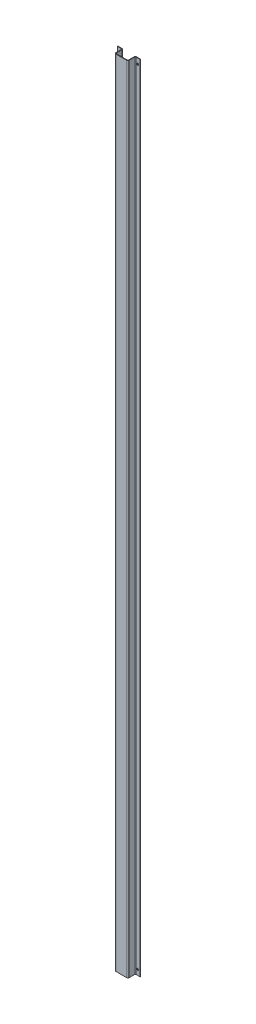
ISO-10303-21;
HEADER;
FILE_DESCRIPTION(('STEP AP214'),'2;1');
FILE_NAME('part.step','',(''),(''),'','','');
FILE_SCHEMA(('AUTOMOTIVE_DESIGN { 1 0 10303 214 1 1 1 1 }'));
ENDSEC;
DATA;
#1=APPLICATION_CONTEXT('core data for automotive mechanical design processes');
#2=APPLICATION_PROTOCOL_DEFINITION('international standard','automotive_design',2000,#1);
#3=PRODUCT_CONTEXT('',#1,'mechanical');
#4=PRODUCT('Part','Part','',(#3));
#5=PRODUCT_RELATED_PRODUCT_CATEGORY('part','',(#4));
#6=PRODUCT_DEFINITION_FORMATION('','',#4);
#7=PRODUCT_DEFINITION_CONTEXT('part definition',#1,'design');
#8=PRODUCT_DEFINITION('design','',#6,#7);
#9=PRODUCT_DEFINITION_SHAPE('','',#8);
#10=(LENGTH_UNIT() NAMED_UNIT(*) SI_UNIT(.MILLI.,.METRE.));
#11=(NAMED_UNIT(*) PLANE_ANGLE_UNIT() SI_UNIT($,.RADIAN.));
#12=(NAMED_UNIT(*) SI_UNIT($,.STERADIAN.) SOLID_ANGLE_UNIT());
#13=UNCERTAINTY_MEASURE_WITH_UNIT(LENGTH_MEASURE(1.E-05),#10,'distance_accuracy_value','');
#14=(GEOMETRIC_REPRESENTATION_CONTEXT(3) GLOBAL_UNCERTAINTY_ASSIGNED_CONTEXT((#13)) GLOBAL_UNIT_ASSIGNED_CONTEXT((#10,
#11,#12)) REPRESENTATION_CONTEXT('',''));
#15=CARTESIAN_POINT('',(0.,0.,0.));
#16=DIRECTION('',(0.,0.,1.));
#17=DIRECTION('',(1.,0.,0.));
#18=AXIS2_PLACEMENT_3D('',#15,#16,#17);
#19=CARTESIAN_POINT('',(25.0000000000001,1500.,-30.));
#20=DIRECTION('',(0.,1.,1.11022302462516E-13));
#21=DIRECTION('',(0.,-1.11022302462516E-13,1.));
#22=AXIS2_PLACEMENT_3D('',#19,#20,#21);
#23=PLANE('',#22);
#24=DIRECTION('',(0.,1.11022302462516E-13,-1.));
#25=VECTOR('',#24,1.);
#26=CARTESIAN_POINT('',(25.0000000000001,1500.,-30.));
#27=LINE('',#26,#25);
#28=CARTESIAN_POINT('',(25.,1500.,-4.50000000000001));
#29=VERTEX_POINT('',#28);
#30=CARTESIAN_POINT('',(25.0000000000001,1500.,-25.5));
#31=VERTEX_POINT('',#30);
#32=EDGE_CURVE('E422',#29,#31,#27,.T.);
#33=ORIENTED_EDGE('',*,*,#32,.T.);
#34=DIRECTION('',(-1.,0.,0.));
#35=VECTOR('',#34,1.);
#36=CARTESIAN_POINT('',(25.,1500.,-25.5));
#37=LINE('',#36,#35);
#38=CARTESIAN_POINT('',(23.,1500.,-25.5));
#39=VERTEX_POINT('',#38);
#40=EDGE_CURVE('E309',#31,#39,#37,.T.);
#41=ORIENTED_EDGE('',*,*,#40,.T.);
#42=DIRECTION('',(0.,-1.11022302462516E-13,1.));
#43=VECTOR('',#42,1.);
#44=CARTESIAN_POINT('',(23.,1500.,1.66620189867572E-10));
#45=LINE('',#44,#43);
#46=CARTESIAN_POINT('',(23.,1500.,-4.50000000000002));
#47=VERTEX_POINT('',#46);
#48=EDGE_CURVE('E426',#47,#39,#45,.F.);
#49=ORIENTED_EDGE('',*,*,#48,.F.);
#50=DIRECTION('',(1.,0.,0.));
#51=VECTOR('',#50,1.);
#52=CARTESIAN_POINT('',(25.,1500.,-4.49999999999999));
#53=LINE('',#52,#51);
#54=EDGE_CURVE('E416',#47,#29,#53,.T.);
#55=ORIENTED_EDGE('',*,*,#54,.T.);
#56=EDGE_LOOP('',(#33,#41,#49,#55));
#57=FACE_BOUND('',#56,.T.);
#58=ADVANCED_FACE('F120',(#57),#23,.T.);
#59=CARTESIAN_POINT('',(25.,0.,0.));
#60=DIRECTION('',(1.,0.,0.));
#61=DIRECTION('',(0.,0.,-1.));
#62=AXIS2_PLACEMENT_3D('',#59,#60,#61);
#63=PLANE('',#62);
#64=DIRECTION('',(0.,-1.11022302462516E-13,1.));
#65=VECTOR('',#64,1.);
#66=CARTESIAN_POINT('',(25.,-1500.,-1.99999999999999));
#67=LINE('',#66,#65);
#68=CARTESIAN_POINT('',(25.0000000000001,-1500.,-25.5));
#69=VERTEX_POINT('',#68);
#70=CARTESIAN_POINT('',(25.,-1500.,-4.50000000000003));
#71=VERTEX_POINT('',#70);
#72=EDGE_CURVE('E419',#69,#71,#67,.T.);
#73=ORIENTED_EDGE('',*,*,#72,.F.);
#74=DIRECTION('',(0.,1.,0.));
#75=VECTOR('',#74,1.);
#76=CARTESIAN_POINT('',(25.,1500.,-25.5));
#77=LINE('',#76,#75);
#78=EDGE_CURVE('E144',#31,#69,#77,.F.);
#79=ORIENTED_EDGE('',*,*,#78,.F.);
#80=ORIENTED_EDGE('',*,*,#32,.F.);
#81=DIRECTION('',(0.,-1.,0.));
#82=VECTOR('',#81,1.);
#83=CARTESIAN_POINT('',(25.,0.,-4.50000000000001));
#84=LINE('',#83,#82);
#85=EDGE_CURVE('E429',#29,#71,#84,.T.);
#86=ORIENTED_EDGE('',*,*,#85,.T.);
#87=EDGE_LOOP('',(#73,#79,#80,#86));
#88=FACE_BOUND('',#87,.T.);
#89=ADVANCED_FACE('F480',(#88),#63,.T.);
#90=CARTESIAN_POINT('',(23.,0.,0.));
#91=DIRECTION('',(1.,0.,0.));
#92=DIRECTION('',(0.,0.,-1.));
#93=AXIS2_PLACEMENT_3D('',#90,#91,#92);
#94=PLANE('',#93);
#95=DIRECTION('',(0.,1.,0.));
#96=VECTOR('',#95,1.);
#97=CARTESIAN_POINT('',(23.,1500.,-25.5));
#98=LINE('',#97,#96);
#99=CARTESIAN_POINT('',(23.0000000000001,-1500.,-25.5));
#100=VERTEX_POINT('',#99);
#101=EDGE_CURVE('E303',#39,#100,#98,.F.);
#102=ORIENTED_EDGE('',*,*,#101,.T.);
#103=DIRECTION('',(0.,1.11022302462516E-13,-1.));
#104=VECTOR('',#103,1.);
#105=CARTESIAN_POINT('',(23.,-1500.,-1.66446717519975E-10));
#106=LINE('',#105,#104);
#107=CARTESIAN_POINT('',(23.,-1500.,-4.50000000000002));
#108=VERTEX_POINT('',#107);
#109=EDGE_CURVE('E424',#100,#108,#106,.F.);
#110=ORIENTED_EDGE('',*,*,#109,.T.);
#111=DIRECTION('',(0.,1.,0.));
#112=VECTOR('',#111,1.);
#113=CARTESIAN_POINT('',(23.,1500.,-4.49999999999999));
#114=LINE('',#113,#112);
#115=EDGE_CURVE('E435',#47,#108,#114,.F.);
#116=ORIENTED_EDGE('',*,*,#115,.F.);
#117=ORIENTED_EDGE('',*,*,#48,.T.);
#118=EDGE_LOOP('',(#102,#110,#116,#117));
#119=FACE_BOUND('',#118,.T.);
#120=ADVANCED_FACE('F490',(#119),#94,.F.);
#121=CARTESIAN_POINT('',(-25.0000000000001,-1500.,-30.));
#122=DIRECTION('',(0.,-1.,-1.11022302462516E-13));
#123=DIRECTION('',(0.,1.11022302462516E-13,-1.));
#124=AXIS2_PLACEMENT_3D('',#121,#122,#123);
#125=PLANE('',#124);
#126=DIRECTION('',(0.,1.11022302462516E-13,-1.));
#127=VECTOR('',#126,1.);
#128=CARTESIAN_POINT('',(-25.0000000000001,-1500.,-30.));
#129=LINE('',#128,#127);
#130=CARTESIAN_POINT('',(-25.,-1500.,-4.49999999999996));
#131=VERTEX_POINT('',#130);
#132=CARTESIAN_POINT('',(-25.0000000000001,-1500.,-25.5));
#133=VERTEX_POINT('',#132);
#134=EDGE_CURVE('E377',#131,#133,#129,.T.);
#135=ORIENTED_EDGE('',*,*,#134,.T.);
#136=DIRECTION('',(1.,0.,0.));
#137=VECTOR('',#136,1.);
#138=CARTESIAN_POINT('',(-25.0000000000001,-1500.,-25.5));
#139=LINE('',#138,#137);
#140=CARTESIAN_POINT('',(-23.0000000000001,-1500.,-25.5));
#141=VERTEX_POINT('',#140);
#142=EDGE_CURVE('E358',#133,#141,#139,.T.);
#143=ORIENTED_EDGE('',*,*,#142,.T.);
#144=DIRECTION('',(0.,-1.11022302462516E-13,1.));
#145=VECTOR('',#144,1.);
#146=CARTESIAN_POINT('',(-23.,-1500.,-1.66446717519975E-10));
#147=LINE('',#146,#145);
#148=CARTESIAN_POINT('',(-23.,-1500.,-4.49999999999997));
#149=VERTEX_POINT('',#148);
#150=EDGE_CURVE('E382',#149,#141,#147,.F.);
#151=ORIENTED_EDGE('',*,*,#150,.F.);
#152=DIRECTION('',(-1.,0.,0.));
#153=VECTOR('',#152,1.);
#154=CARTESIAN_POINT('',(-25.,-1500.,-4.49999999999999));
#155=LINE('',#154,#153);
#156=EDGE_CURVE('E372',#149,#131,#155,.T.);
#157=ORIENTED_EDGE('',*,*,#156,.T.);
#158=EDGE_LOOP('',(#135,#143,#151,#157));
#159=FACE_BOUND('',#158,.T.);
#160=ADVANCED_FACE('F599',(#159),#125,.T.);
#161=CARTESIAN_POINT('',(-25.,0.,0.));
#162=DIRECTION('',(-1.,0.,0.));
#163=DIRECTION('',(0.,0.,1.));
#164=AXIS2_PLACEMENT_3D('',#161,#162,#163);
#165=PLANE('',#164);
#166=DIRECTION('',(0.,-1.11022302462516E-13,1.));
#167=VECTOR('',#166,1.);
#168=CARTESIAN_POINT('',(-25.,1500.,-1.99999999999999));
#169=LINE('',#168,#167);
#170=CARTESIAN_POINT('',(-25.0000000000001,1500.,-25.5));
#171=VERTEX_POINT('',#170);
#172=CARTESIAN_POINT('',(-25.,1500.,-4.49999999999994));
#173=VERTEX_POINT('',#172);
#174=EDGE_CURVE('E374',#171,#173,#169,.T.);
#175=ORIENTED_EDGE('',*,*,#174,.F.);
#176=DIRECTION('',(0.,-1.,0.));
#177=VECTOR('',#176,1.);
#178=CARTESIAN_POINT('',(-25.0000000000001,-1500.,-25.5));
#179=LINE('',#178,#177);
#180=EDGE_CURVE('E364',#133,#171,#179,.F.);
#181=ORIENTED_EDGE('',*,*,#180,.F.);
#182=ORIENTED_EDGE('',*,*,#134,.F.);
#183=DIRECTION('',(0.,1.,0.));
#184=VECTOR('',#183,1.);
#185=CARTESIAN_POINT('',(-25.,0.,-4.49999999999996));
#186=LINE('',#185,#184);
#187=EDGE_CURVE('E385',#131,#173,#186,.T.);
#188=ORIENTED_EDGE('',*,*,#187,.T.);
#189=EDGE_LOOP('',(#175,#181,#182,#188));
#190=FACE_BOUND('',#189,.T.);
#191=ADVANCED_FACE('F603',(#190),#165,.T.);
#192=CARTESIAN_POINT('',(-23.,0.,0.));
#193=DIRECTION('',(-1.,0.,0.));
#194=DIRECTION('',(0.,0.,1.));
#195=AXIS2_PLACEMENT_3D('',#192,#193,#194);
#196=PLANE('',#195);
#197=DIRECTION('',(0.,-1.,0.));
#198=VECTOR('',#197,1.);
#199=CARTESIAN_POINT('',(-23.0000000000001,-1500.,-25.5));
#200=LINE('',#199,#198);
#201=CARTESIAN_POINT('',(-23.0000000000001,1500.,-25.5));
#202=VERTEX_POINT('',#201);
#203=EDGE_CURVE('E352',#141,#202,#200,.F.);
#204=ORIENTED_EDGE('',*,*,#203,.T.);
#205=DIRECTION('',(0.,1.11022302462516E-13,-1.));
#206=VECTOR('',#205,1.);
#207=CARTESIAN_POINT('',(-23.,1500.,1.66620189867572E-10));
#208=LINE('',#207,#206);
#209=CARTESIAN_POINT('',(-23.,1500.,-4.49999999999997));
#210=VERTEX_POINT('',#209);
#211=EDGE_CURVE('E380',#202,#210,#208,.F.);
#212=ORIENTED_EDGE('',*,*,#211,.T.);
#213=DIRECTION('',(0.,-1.,0.));
#214=VECTOR('',#213,1.);
#215=CARTESIAN_POINT('',(-23.,-1500.,-4.49999999999999));
#216=LINE('',#215,#214);
#217=EDGE_CURVE('E391',#149,#210,#216,.F.);
#218=ORIENTED_EDGE('',*,*,#217,.F.);
#219=ORIENTED_EDGE('',*,*,#150,.T.);
#220=EDGE_LOOP('',(#204,#212,#218,#219));
#221=FACE_BOUND('',#220,.T.);
#222=ADVANCED_FACE('F577',(#221),#196,.F.);
#223=CARTESIAN_POINT('',(0.,0.,-2.));
#224=DIRECTION('',(0.,0.,-1.));
#225=DIRECTION('',(-1.,0.,0.));
#226=AXIS2_PLACEMENT_3D('',#223,#224,#225);
#227=PLANE('',#226);
#228=DIRECTION('',(1.,0.,0.));
#229=VECTOR('',#228,1.);
#230=CARTESIAN_POINT('',(-25.,-1500.,-2.));
#231=LINE('',#230,#229);
#232=CARTESIAN_POINT('',(-20.5,-1500.,-1.99999999999998));
#233=VERTEX_POINT('',#232);
#234=CARTESIAN_POINT('',(20.5,-1500.,-2.));
#235=VERTEX_POINT('',#234);
#236=EDGE_CURVE('E13',#233,#235,#231,.T.);
#237=ORIENTED_EDGE('',*,*,#236,.F.);
#238=DIRECTION('',(0.,1.,0.));
#239=VECTOR('',#238,1.);
#240=CARTESIAN_POINT('',(-20.5,1500.,-1.99999999999998));
#241=LINE('',#240,#239);
#242=CARTESIAN_POINT('',(-20.5,1500.,-1.99999999999998));
#243=VERTEX_POINT('',#242);
#244=EDGE_CURVE('E408',#243,#233,#241,.F.);
#245=ORIENTED_EDGE('',*,*,#244,.F.);
#246=DIRECTION('',(-1.,0.,0.));
#247=VECTOR('',#246,1.);
#248=CARTESIAN_POINT('',(-25.,1500.,-2.));
#249=LINE('',#248,#247);
#250=CARTESIAN_POINT('',(20.5,1500.,-2.));
#251=VERTEX_POINT('',#250);
#252=EDGE_CURVE('E129',#251,#243,#249,.T.);
#253=ORIENTED_EDGE('',*,*,#252,.F.);
#254=DIRECTION('',(0.,-1.,0.));
#255=VECTOR('',#254,1.);
#256=CARTESIAN_POINT('',(20.5,-1500.,-2.00000000000002));
#257=LINE('',#256,#255);
#258=EDGE_CURVE('E452',#235,#251,#257,.F.);
#259=ORIENTED_EDGE('',*,*,#258,.F.);
#260=EDGE_LOOP('',(#237,#245,#253,#259));
#261=FACE_BOUND('',#260,.T.);
#262=ADVANCED_FACE('F574',(#261),#227,.T.);
#263=CARTESIAN_POINT('',(0.,0.,0.));
#264=DIRECTION('',(0.,0.,-1.));
#265=DIRECTION('',(-1.,0.,0.));
#266=AXIS2_PLACEMENT_3D('',#263,#264,#265);
#267=PLANE('',#266);
#268=DIRECTION('',(0.,1.,0.));
#269=VECTOR('',#268,1.);
#270=CARTESIAN_POINT('',(-20.5,1500.,0.));
#271=LINE('',#270,#269);
#272=CARTESIAN_POINT('',(-20.5,1500.,0.));
#273=VERTEX_POINT('',#272);
#274=CARTESIAN_POINT('',(-20.5,-1500.,0.));
#275=VERTEX_POINT('',#274);
#276=EDGE_CURVE('E396',#273,#275,#271,.F.);
#277=ORIENTED_EDGE('',*,*,#276,.T.);
#278=DIRECTION('',(1.,0.,0.));
#279=VECTOR('',#278,1.);
#280=CARTESIAN_POINT('',(-25.,-1500.,0.));
#281=LINE('',#280,#279);
#282=CARTESIAN_POINT('',(20.5,-1500.,0.));
#283=VERTEX_POINT('',#282);
#284=EDGE_CURVE('E124',#275,#283,#281,.T.);
#285=ORIENTED_EDGE('',*,*,#284,.T.);
#286=DIRECTION('',(0.,-1.,0.));
#287=VECTOR('',#286,1.);
#288=CARTESIAN_POINT('',(20.5,-1500.,0.));
#289=LINE('',#288,#287);
#290=CARTESIAN_POINT('',(20.5,1500.,0.));
#291=VERTEX_POINT('',#290);
#292=EDGE_CURVE('E440',#283,#291,#289,.F.);
#293=ORIENTED_EDGE('',*,*,#292,.T.);
#294=DIRECTION('',(-1.,0.,0.));
#295=VECTOR('',#294,1.);
#296=CARTESIAN_POINT('',(-25.,1500.,0.));
#297=LINE('',#296,#295);
#298=EDGE_CURVE('E460',#291,#273,#297,.T.);
#299=ORIENTED_EDGE('',*,*,#298,.T.);
#300=EDGE_LOOP('',(#277,#285,#293,#299));
#301=FACE_BOUND('',#300,.T.);
#302=ADVANCED_FACE('F468',(#301),#267,.F.);
#303=CARTESIAN_POINT('',(-25.,1500.,-2.));
#304=DIRECTION('',(0.,1.,0.));
#305=DIRECTION('',(0.,0.,1.));
#306=AXIS2_PLACEMENT_3D('',#303,#304,#305);
#307=PLANE('',#306);
#308=ORIENTED_EDGE('',*,*,#252,.T.);
#309=DIRECTION('',(0.,0.,1.));
#310=VECTOR('',#309,1.);
#311=CARTESIAN_POINT('',(-20.5,1500.,-1.99999999999998));
#312=LINE('',#311,#310);
#313=EDGE_CURVE('E402',#243,#273,#312,.T.);
#314=ORIENTED_EDGE('',*,*,#313,.T.);
#315=ORIENTED_EDGE('',*,*,#298,.F.);
#316=DIRECTION('',(0.,0.,1.));
#317=VECTOR('',#316,1.);
#318=CARTESIAN_POINT('',(20.5,1500.,-2.00000000000002));
#319=LINE('',#318,#317);
#320=EDGE_CURVE('E457',#251,#291,#319,.T.);
#321=ORIENTED_EDGE('',*,*,#320,.F.);
#322=EDGE_LOOP('',(#308,#314,#315,#321));
#323=FACE_BOUND('',#322,.T.);
#324=ADVANCED_FACE('F122',(#323),#307,.T.);
#325=CARTESIAN_POINT('',(-25.,-1500.,-2.));
#326=DIRECTION('',(0.,-1.,0.));
#327=DIRECTION('',(0.,0.,-1.));
#328=AXIS2_PLACEMENT_3D('',#325,#326,#327);
#329=PLANE('',#328);
#330=DIRECTION('',(0.,0.,1.));
#331=VECTOR('',#330,1.);
#332=CARTESIAN_POINT('',(-20.5,-1500.,-1.99999999999998));
#333=LINE('',#332,#331);
#334=EDGE_CURVE('E413',#233,#275,#333,.T.);
#335=ORIENTED_EDGE('',*,*,#334,.F.);
#336=ORIENTED_EDGE('',*,*,#236,.T.);
#337=DIRECTION('',(0.,0.,1.));
#338=VECTOR('',#337,1.);
#339=CARTESIAN_POINT('',(20.5,-1500.,-2.00000000000002));
#340=LINE('',#339,#338);
#341=EDGE_CURVE('E446',#235,#283,#340,.T.);
#342=ORIENTED_EDGE('',*,*,#341,.T.);
#343=ORIENTED_EDGE('',*,*,#284,.F.);
#344=EDGE_LOOP('',(#335,#336,#342,#343));
#345=FACE_BOUND('',#344,.T.);
#346=ADVANCED_FACE('F571',(#345),#329,.T.);
#347=CARTESIAN_POINT('',(20.5,1500.,-4.50000000000002));
#348=DIRECTION('',(0.,1.,0.));
#349=DIRECTION('',(0.,0.,1.));
#350=AXIS2_PLACEMENT_3D('',#347,#348,#349);
#351=PLANE('',#350);
#352=ORIENTED_EDGE('',*,*,#54,.F.);
#353=CARTESIAN_POINT('',(20.5,1500.,-4.50000000000002));
#354=DIRECTION('',(0.,-1.,0.));
#355=DIRECTION('',(0.,0.,-1.));
#356=AXIS2_PLACEMENT_3D('',#353,#354,#355);
#357=CIRCLE('',#356,2.5);
#358=EDGE_CURVE('E449',#251,#47,#357,.F.);
#359=ORIENTED_EDGE('',*,*,#358,.F.);
#360=ORIENTED_EDGE('',*,*,#320,.T.);
#361=CARTESIAN_POINT('',(20.5,1500.,-4.50000000000002));
#362=DIRECTION('',(0.,-1.,0.));
#363=DIRECTION('',(0.,0.,-1.));
#364=AXIS2_PLACEMENT_3D('',#361,#362,#363);
#365=CIRCLE('',#364,4.5);
#366=EDGE_CURVE('E442',#291,#29,#365,.F.);
#367=ORIENTED_EDGE('',*,*,#366,.T.);
#368=EDGE_LOOP('',(#352,#359,#360,#367));
#369=FACE_BOUND('',#368,.T.);
#370=ADVANCED_FACE('F482',(#369),#351,.T.);
#371=CARTESIAN_POINT('',(20.5,-1500.,-4.50000000000002));
#372=DIRECTION('',(0.,1.,0.));
#373=DIRECTION('',(0.,0.,1.));
#374=AXIS2_PLACEMENT_3D('',#371,#372,#373);
#375=PLANE('',#374);
#376=CARTESIAN_POINT('',(20.5,-1500.,-4.50000000000002));
#377=DIRECTION('',(0.,-1.,0.));
#378=DIRECTION('',(0.,0.,-1.));
#379=AXIS2_PLACEMENT_3D('',#376,#377,#378);
#380=CIRCLE('',#379,2.5);
#381=EDGE_CURVE('E421',#108,#235,#380,.T.);
#382=ORIENTED_EDGE('',*,*,#381,.F.);
#383=DIRECTION('',(1.,0.,0.));
#384=VECTOR('',#383,1.);
#385=CARTESIAN_POINT('',(23.,-1500.,-4.50000000000004));
#386=LINE('',#385,#384);
#387=EDGE_CURVE('E432',#108,#71,#386,.T.);
#388=ORIENTED_EDGE('',*,*,#387,.T.);
#389=CARTESIAN_POINT('',(20.5,-1500.,-4.50000000000002));
#390=DIRECTION('',(0.,-1.,0.));
#391=DIRECTION('',(0.,0.,-1.));
#392=AXIS2_PLACEMENT_3D('',#389,#390,#391);
#393=CIRCLE('',#392,4.5);
#394=EDGE_CURVE('E443',#71,#283,#393,.T.);
#395=ORIENTED_EDGE('',*,*,#394,.T.);
#396=ORIENTED_EDGE('',*,*,#341,.F.);
#397=EDGE_LOOP('',(#382,#388,#395,#396));
#398=FACE_BOUND('',#397,.T.);
#399=ADVANCED_FACE('F478',(#398),#375,.F.);
#400=CARTESIAN_POINT('',(20.5,-1500.,-4.50000000000002));
#401=DIRECTION('',(0.,-1.,0.));
#402=DIRECTION('',(1.,0.,0.));
#403=AXIS2_PLACEMENT_3D('',#400,#401,#402);
#404=CYLINDRICAL_SURFACE('',#403,4.5);
#405=ORIENTED_EDGE('',*,*,#292,.F.);
#406=ORIENTED_EDGE('',*,*,#394,.F.);
#407=ORIENTED_EDGE('',*,*,#85,.F.);
#408=ORIENTED_EDGE('',*,*,#366,.F.);
#409=EDGE_LOOP('',(#405,#406,#407,#408));
#410=FACE_BOUND('',#409,.T.);
#411=ADVANCED_FACE('F474',(#410),#404,.T.);
#412=CARTESIAN_POINT('',(20.5,-1500.,-4.50000000000002));
#413=DIRECTION('',(0.,-1.,0.));
#414=DIRECTION('',(1.,0.,0.));
#415=AXIS2_PLACEMENT_3D('',#412,#413,#414);
#416=CYLINDRICAL_SURFACE('',#415,2.5);
#417=ORIENTED_EDGE('',*,*,#258,.T.);
#418=ORIENTED_EDGE('',*,*,#358,.T.);
#419=ORIENTED_EDGE('',*,*,#115,.T.);
#420=ORIENTED_EDGE('',*,*,#381,.T.);
#421=EDGE_LOOP('',(#417,#418,#419,#420));
#422=FACE_BOUND('',#421,.T.);
#423=ADVANCED_FACE('F565',(#422),#416,.F.);
#424=CARTESIAN_POINT('',(25.,-1500.,-1.99999999999999));
#425=DIRECTION('',(0.,-1.,-1.11022302462516E-13));
#426=DIRECTION('',(0.,1.11022302462516E-13,-1.));
#427=AXIS2_PLACEMENT_3D('',#424,#425,#426);
#428=PLANE('',#427);
#429=DIRECTION('',(-1.,0.,0.));
#430=VECTOR('',#429,1.);
#431=CARTESIAN_POINT('',(25.,-1500.,-25.5));
#432=LINE('',#431,#430);
#433=EDGE_CURVE('E137',#69,#100,#432,.T.);
#434=ORIENTED_EDGE('',*,*,#433,.F.);
#435=ORIENTED_EDGE('',*,*,#72,.T.);
#436=ORIENTED_EDGE('',*,*,#387,.F.);
#437=ORIENTED_EDGE('',*,*,#109,.F.);
#438=EDGE_LOOP('',(#434,#435,#436,#437));
#439=FACE_BOUND('',#438,.T.);
#440=ADVANCED_FACE('F561',(#439),#428,.T.);
#441=CARTESIAN_POINT('',(-20.5,-1500.,-4.49999999999998));
#442=DIRECTION('',(0.,-1.,0.));
#443=DIRECTION('',(0.,0.,-1.));
#444=AXIS2_PLACEMENT_3D('',#441,#442,#443);
#445=PLANE('',#444);
#446=ORIENTED_EDGE('',*,*,#156,.F.);
#447=CARTESIAN_POINT('',(-20.5,-1500.,-4.49999999999998));
#448=DIRECTION('',(0.,1.,0.));
#449=DIRECTION('',(0.,0.,1.));
#450=AXIS2_PLACEMENT_3D('',#447,#448,#449);
#451=CIRCLE('',#450,2.5);
#452=EDGE_CURVE('E405',#233,#149,#451,.F.);
#453=ORIENTED_EDGE('',*,*,#452,.F.);
#454=ORIENTED_EDGE('',*,*,#334,.T.);
#455=CARTESIAN_POINT('',(-20.5,-1500.,-4.49999999999998));
#456=DIRECTION('',(0.,1.,0.));
#457=DIRECTION('',(0.,0.,1.));
#458=AXIS2_PLACEMENT_3D('',#455,#456,#457);
#459=CIRCLE('',#458,4.5);
#460=EDGE_CURVE('E398',#275,#131,#459,.F.);
#461=ORIENTED_EDGE('',*,*,#460,.T.);
#462=EDGE_LOOP('',(#446,#453,#454,#461));
#463=FACE_BOUND('',#462,.T.);
#464=ADVANCED_FACE('F595',(#463),#445,.T.);
#465=CARTESIAN_POINT('',(-20.5,1500.,-4.49999999999998));
#466=DIRECTION('',(0.,-1.,0.));
#467=DIRECTION('',(0.,0.,-1.));
#468=AXIS2_PLACEMENT_3D('',#465,#466,#467);
#469=PLANE('',#468);
#470=CARTESIAN_POINT('',(-20.5,1500.,-4.49999999999998));
#471=DIRECTION('',(0.,1.,0.));
#472=DIRECTION('',(0.,0.,1.));
#473=AXIS2_PLACEMENT_3D('',#470,#471,#472);
#474=CIRCLE('',#473,2.5);
#475=EDGE_CURVE('E376',#210,#243,#474,.T.);
#476=ORIENTED_EDGE('',*,*,#475,.F.);
#477=DIRECTION('',(-1.,0.,0.));
#478=VECTOR('',#477,1.);
#479=CARTESIAN_POINT('',(-23.,1500.,-4.49999999999995));
#480=LINE('',#479,#478);
#481=EDGE_CURVE('E388',#210,#173,#480,.T.);
#482=ORIENTED_EDGE('',*,*,#481,.T.);
#483=CARTESIAN_POINT('',(-20.5,1500.,-4.49999999999998));
#484=DIRECTION('',(0.,1.,0.));
#485=DIRECTION('',(0.,0.,1.));
#486=AXIS2_PLACEMENT_3D('',#483,#484,#485);
#487=CIRCLE('',#486,4.5);
#488=EDGE_CURVE('E399',#173,#273,#487,.T.);
#489=ORIENTED_EDGE('',*,*,#488,.T.);
#490=ORIENTED_EDGE('',*,*,#313,.F.);
#491=EDGE_LOOP('',(#476,#482,#489,#490));
#492=FACE_BOUND('',#491,.T.);
#493=ADVANCED_FACE('F662',(#492),#469,.F.);
#494=CARTESIAN_POINT('',(-20.5,1500.,-4.49999999999998));
#495=DIRECTION('',(0.,1.,0.));
#496=DIRECTION('',(-1.,0.,0.));
#497=AXIS2_PLACEMENT_3D('',#494,#495,#496);
#498=CYLINDRICAL_SURFACE('',#497,4.5);
#499=ORIENTED_EDGE('',*,*,#276,.F.);
#500=ORIENTED_EDGE('',*,*,#488,.F.);
#501=ORIENTED_EDGE('',*,*,#187,.F.);
#502=ORIENTED_EDGE('',*,*,#460,.F.);
#503=EDGE_LOOP('',(#499,#500,#501,#502));
#504=FACE_BOUND('',#503,.T.);
#505=ADVANCED_FACE('F659',(#504),#498,.T.);
#506=CARTESIAN_POINT('',(-20.5,1500.,-4.49999999999998));
#507=DIRECTION('',(0.,1.,0.));
#508=DIRECTION('',(-1.,0.,0.));
#509=AXIS2_PLACEMENT_3D('',#506,#507,#508);
#510=CYLINDRICAL_SURFACE('',#509,2.5);
#511=ORIENTED_EDGE('',*,*,#244,.T.);
#512=ORIENTED_EDGE('',*,*,#452,.T.);
#513=ORIENTED_EDGE('',*,*,#217,.T.);
#514=ORIENTED_EDGE('',*,*,#475,.T.);
#515=EDGE_LOOP('',(#511,#512,#513,#514));
#516=FACE_BOUND('',#515,.T.);
#517=ADVANCED_FACE('F592',(#516),#510,.F.);
#518=CARTESIAN_POINT('',(-25.,1500.,-1.99999999999999));
#519=DIRECTION('',(0.,1.,1.11022302462516E-13));
#520=DIRECTION('',(0.,-1.11022302462516E-13,1.));
#521=AXIS2_PLACEMENT_3D('',#518,#519,#520);
#522=PLANE('',#521);
#523=DIRECTION('',(1.,0.,0.));
#524=VECTOR('',#523,1.);
#525=CARTESIAN_POINT('',(-25.0000000000001,1500.,-25.5));
#526=LINE('',#525,#524);
#527=EDGE_CURVE('E369',#171,#202,#526,.T.);
#528=ORIENTED_EDGE('',*,*,#527,.F.);
#529=ORIENTED_EDGE('',*,*,#174,.T.);
#530=ORIENTED_EDGE('',*,*,#481,.F.);
#531=ORIENTED_EDGE('',*,*,#211,.F.);
#532=EDGE_LOOP('',(#528,#529,#530,#531));
#533=FACE_BOUND('',#532,.T.);
#534=ADVANCED_FACE('F646',(#533),#522,.T.);
#535=CARTESIAN_POINT('',(-27.5000000000001,1500.,-25.5));
#536=DIRECTION('',(0.,1.,0.));
#537=DIRECTION('',(0.,0.,1.));
#538=AXIS2_PLACEMENT_3D('',#535,#536,#537);
#539=PLANE('',#538);
#540=DIRECTION('',(0.,0.,1.));
#541=VECTOR('',#540,1.);
#542=CARTESIAN_POINT('',(-27.5000000000001,1500.,-30.));
#543=LINE('',#542,#541);
#544=CARTESIAN_POINT('',(-27.5000000000001,1500.,-28.));
#545=VERTEX_POINT('',#544);
#546=CARTESIAN_POINT('',(-27.5000000000001,1500.,-30.));
#547=VERTEX_POINT('',#546);
#548=EDGE_CURVE('E320',#545,#547,#543,.F.);
#549=ORIENTED_EDGE('',*,*,#548,.F.);
#550=CARTESIAN_POINT('',(-27.5000000000001,1500.,-25.5));
#551=DIRECTION('',(0.,-1.,0.));
#552=DIRECTION('',(0.,0.,-1.));
#553=AXIS2_PLACEMENT_3D('',#550,#551,#552);
#554=CIRCLE('',#553,2.5);
#555=EDGE_CURVE('E361',#171,#545,#554,.F.);
#556=ORIENTED_EDGE('',*,*,#555,.F.);
#557=ORIENTED_EDGE('',*,*,#527,.T.);
#558=CARTESIAN_POINT('',(-27.5000000000001,1500.,-25.5));
#559=DIRECTION('',(0.,-1.,0.));
#560=DIRECTION('',(0.,0.,-1.));
#561=AXIS2_PLACEMENT_3D('',#558,#559,#560);
#562=CIRCLE('',#561,4.5);
#563=EDGE_CURVE('E354',#202,#547,#562,.F.);
#564=ORIENTED_EDGE('',*,*,#563,.T.);
#565=EDGE_LOOP('',(#549,#556,#557,#564));
#566=FACE_BOUND('',#565,.T.);
#567=ADVANCED_FACE('F610',(#566),#539,.T.);
#568=CARTESIAN_POINT('',(-27.5000000000001,-1500.,-25.5));
#569=DIRECTION('',(0.,1.,0.));
#570=DIRECTION('',(0.,0.,1.));
#571=AXIS2_PLACEMENT_3D('',#568,#569,#570);
#572=PLANE('',#571);
#573=CARTESIAN_POINT('',(-27.5000000000001,-1500.,-25.5));
#574=DIRECTION('',(0.,-1.,0.));
#575=DIRECTION('',(0.,0.,-1.));
#576=AXIS2_PLACEMENT_3D('',#573,#574,#575);
#577=CIRCLE('',#576,2.5);
#578=CARTESIAN_POINT('',(-27.5000000000001,-1500.,-28.));
#579=VERTEX_POINT('',#578);
#580=EDGE_CURVE('E325',#579,#133,#577,.T.);
#581=ORIENTED_EDGE('',*,*,#580,.F.);
#582=DIRECTION('',(0.,0.,1.));
#583=VECTOR('',#582,1.);
#584=CARTESIAN_POINT('',(-27.5000000000002,-1500.,-28.));
#585=LINE('',#584,#583);
#586=CARTESIAN_POINT('',(-27.5000000000002,-1500.,-30.));
#587=VERTEX_POINT('',#586);
#588=EDGE_CURVE('E345',#579,#587,#585,.F.);
#589=ORIENTED_EDGE('',*,*,#588,.T.);
#590=CARTESIAN_POINT('',(-27.5000000000001,-1500.,-25.5));
#591=DIRECTION('',(0.,-1.,0.));
#592=DIRECTION('',(0.,0.,-1.));
#593=AXIS2_PLACEMENT_3D('',#590,#591,#592);
#594=CIRCLE('',#593,4.5);
#595=EDGE_CURVE('E355',#587,#141,#594,.T.);
#596=ORIENTED_EDGE('',*,*,#595,.T.);
#597=ORIENTED_EDGE('',*,*,#142,.F.);
#598=EDGE_LOOP('',(#581,#589,#596,#597));
#599=FACE_BOUND('',#598,.T.);
#600=ADVANCED_FACE('F628',(#599),#572,.F.);
#601=CARTESIAN_POINT('',(-27.5000000000001,-1500.,-25.5));
#602=DIRECTION('',(0.,-1.,0.));
#603=DIRECTION('',(0.,0.,-1.));
#604=AXIS2_PLACEMENT_3D('',#601,#602,#603);
#605=CYLINDRICAL_SURFACE('',#604,4.5);
#606=ORIENTED_EDGE('',*,*,#203,.F.);
#607=ORIENTED_EDGE('',*,*,#595,.F.);
#608=DIRECTION('',(0.,-1.,0.));
#609=VECTOR('',#608,1.);
#610=CARTESIAN_POINT('',(-27.5000000000001,1500.,-30.));
#611=LINE('',#610,#609);
#612=EDGE_CURVE('E343',#587,#547,#611,.F.);
#613=ORIENTED_EDGE('',*,*,#612,.T.);
#614=ORIENTED_EDGE('',*,*,#563,.F.);
#615=EDGE_LOOP('',(#606,#607,#613,#614));
#616=FACE_BOUND('',#615,.T.);
#617=ADVANCED_FACE('F638',(#616),#605,.T.);
#618=CARTESIAN_POINT('',(-27.5000000000001,-1500.,-25.5));
#619=DIRECTION('',(0.,-1.,0.));
#620=DIRECTION('',(0.,0.,-1.));
#621=AXIS2_PLACEMENT_3D('',#618,#619,#620);
#622=CYLINDRICAL_SURFACE('',#621,2.5);
#623=ORIENTED_EDGE('',*,*,#180,.T.);
#624=ORIENTED_EDGE('',*,*,#555,.T.);
#625=DIRECTION('',(0.,-1.,0.));
#626=VECTOR('',#625,1.);
#627=CARTESIAN_POINT('',(-27.5000000000001,1500.,-28.));
#628=LINE('',#627,#626);
#629=EDGE_CURVE('E348',#545,#579,#628,.T.);
#630=ORIENTED_EDGE('',*,*,#629,.T.);
#631=ORIENTED_EDGE('',*,*,#580,.T.);
#632=EDGE_LOOP('',(#623,#624,#630,#631));
#633=FACE_BOUND('',#632,.T.);
#634=ADVANCED_FACE('F606',(#633),#622,.F.);
#635=CARTESIAN_POINT('',(-43.0000000000001,-1500.,-30.));
#636=DIRECTION('',(0.,1.,0.));
#637=DIRECTION('',(0.,0.,1.));
#638=AXIS2_PLACEMENT_3D('',#635,#636,#637);
#639=PLANE('',#638);
#640=ORIENTED_EDGE('',*,*,#588,.F.);
#641=DIRECTION('',(1.,0.,0.));
#642=VECTOR('',#641,1.);
#643=CARTESIAN_POINT('',(-43.0000000000001,-1500.,-28.));
#644=LINE('',#643,#642);
#645=CARTESIAN_POINT('',(-43.0000000000001,-1500.,-28.));
#646=VERTEX_POINT('',#645);
#647=EDGE_CURVE('E341',#579,#646,#644,.F.);
#648=ORIENTED_EDGE('',*,*,#647,.T.);
#649=DIRECTION('',(0.,0.,1.));
#650=VECTOR('',#649,1.);
#651=CARTESIAN_POINT('',(-43.0000000000001,-1500.,-30.));
#652=LINE('',#651,#650);
#653=CARTESIAN_POINT('',(-43.0000000000001,-1500.,-30.));
#654=VERTEX_POINT('',#653);
#655=EDGE_CURVE('E322',#654,#646,#652,.T.);
#656=ORIENTED_EDGE('',*,*,#655,.F.);
#657=DIRECTION('',(-1.,0.,0.));
#658=VECTOR('',#657,1.);
#659=CARTESIAN_POINT('',(0.,-1500.,-30.));
#660=LINE('',#659,#658);
#661=EDGE_CURVE('E334',#587,#654,#660,.T.);
#662=ORIENTED_EDGE('',*,*,#661,.F.);
#663=EDGE_LOOP('',(#640,#648,#656,#662));
#664=FACE_BOUND('',#663,.T.);
#665=ADVANCED_FACE('F630',(#664),#639,.F.);
#666=CARTESIAN_POINT('',(-25.0000000000001,1500.,-30.));
#667=DIRECTION('',(0.,-1.,0.));
#668=DIRECTION('',(0.,0.,-1.));
#669=AXIS2_PLACEMENT_3D('',#666,#667,#668);
#670=PLANE('',#669);
#671=ORIENTED_EDGE('',*,*,#548,.T.);
#672=DIRECTION('',(1.,0.,0.));
#673=VECTOR('',#672,1.);
#674=CARTESIAN_POINT('',(0.,1500.,-30.));
#675=LINE('',#674,#673);
#676=CARTESIAN_POINT('',(-43.0000000000001,1500.,-30.));
#677=VERTEX_POINT('',#676);
#678=EDGE_CURVE('E329',#677,#547,#675,.T.);
#679=ORIENTED_EDGE('',*,*,#678,.F.);
#680=DIRECTION('',(0.,0.,1.));
#681=VECTOR('',#680,1.);
#682=CARTESIAN_POINT('',(-43.0000000000001,1500.,-30.));
#683=LINE('',#682,#681);
#684=CARTESIAN_POINT('',(-43.0000000000001,1500.,-28.));
#685=VERTEX_POINT('',#684);
#686=EDGE_CURVE('E326',#677,#685,#683,.T.);
#687=ORIENTED_EDGE('',*,*,#686,.T.);
#688=DIRECTION('',(-1.,0.,0.));
#689=VECTOR('',#688,1.);
#690=CARTESIAN_POINT('',(-25.0000000000001,1500.,-28.));
#691=LINE('',#690,#689);
#692=EDGE_CURVE('E336',#685,#545,#691,.F.);
#693=ORIENTED_EDGE('',*,*,#692,.T.);
#694=EDGE_LOOP('',(#671,#679,#687,#693));
#695=FACE_BOUND('',#694,.T.);
#696=ADVANCED_FACE('F614',(#695),#670,.F.);
#697=CARTESIAN_POINT('',(0.,0.,-30.));
#698=DIRECTION('',(0.,0.,1.));
#699=DIRECTION('',(1.,0.,0.));
#700=AXIS2_PLACEMENT_3D('',#697,#698,#699);
#701=PLANE('',#700);
#702=CARTESIAN_POINT('',(-34.0000000000001,1480.,-30.));
#703=DIRECTION('',(0.,0.,1.));
#704=DIRECTION('',(1.,0.,0.));
#705=AXIS2_PLACEMENT_3D('',#702,#703,#704);
#706=CIRCLE('',#705,3.49999999999989);
#707=CARTESIAN_POINT('',(-30.5000000000002,1480.,-30.));
#708=VERTEX_POINT('',#707);
#709=EDGE_CURVE('E507',#708,#708,#706,.F.);
#710=ORIENTED_EDGE('',*,*,#709,.F.);
#711=EDGE_LOOP('',(#710));
#712=FACE_BOUND('',#711,.T.);
#713=CARTESIAN_POINT('',(-34.0000000000001,-1480.,-30.));
#714=DIRECTION('',(0.,0.,1.));
#715=DIRECTION('',(1.,0.,0.));
#716=AXIS2_PLACEMENT_3D('',#713,#714,#715);
#717=CIRCLE('',#716,3.49999999999989);
#718=CARTESIAN_POINT('',(-30.5000000000002,-1480.,-30.));
#719=VERTEX_POINT('',#718);
#720=EDGE_CURVE('E302',#719,#719,#717,.T.);
#721=ORIENTED_EDGE('',*,*,#720,.T.);
#722=EDGE_LOOP('',(#721));
#723=FACE_BOUND('',#722,.T.);
#724=ORIENTED_EDGE('',*,*,#612,.F.);
#725=ORIENTED_EDGE('',*,*,#661,.T.);
#726=DIRECTION('',(0.,1.,0.));
#727=VECTOR('',#726,1.);
#728=CARTESIAN_POINT('',(-43.0000000000001,0.,-30.));
#729=LINE('',#728,#727);
#730=EDGE_CURVE('E332',#654,#677,#729,.T.);
#731=ORIENTED_EDGE('',*,*,#730,.T.);
#732=ORIENTED_EDGE('',*,*,#678,.T.);
#733=EDGE_LOOP('',(#724,#725,#731,#732));
#734=FACE_BOUND('',#733,.T.);
#735=ADVANCED_FACE('F618',(#712,#723,#734),#701,.F.);
#736=CARTESIAN_POINT('',(0.,0.,-28.));
#737=DIRECTION('',(0.,0.,1.));
#738=DIRECTION('',(1.,0.,0.));
#739=AXIS2_PLACEMENT_3D('',#736,#737,#738);
#740=PLANE('',#739);
#741=CARTESIAN_POINT('',(-34.0000000000001,1480.,-28.));
#742=DIRECTION('',(0.,0.,-1.));
#743=DIRECTION('',(1.,0.,0.));
#744=AXIS2_PLACEMENT_3D('',#741,#742,#743);
#745=CIRCLE('',#744,3.49999999999989);
#746=CARTESIAN_POINT('',(-30.5000000000002,1480.,-28.));
#747=VERTEX_POINT('',#746);
#748=EDGE_CURVE('E510',#747,#747,#745,.T.);
#749=ORIENTED_EDGE('',*,*,#748,.T.);
#750=EDGE_LOOP('',(#749));
#751=FACE_BOUND('',#750,.T.);
#752=CARTESIAN_POINT('',(-34.0000000000001,-1480.,-28.));
#753=DIRECTION('',(0.,0.,1.));
#754=DIRECTION('',(1.,0.,0.));
#755=AXIS2_PLACEMENT_3D('',#752,#753,#754);
#756=CIRCLE('',#755,3.49999999999989);
#757=CARTESIAN_POINT('',(-30.5000000000002,-1480.,-28.));
#758=VERTEX_POINT('',#757);
#759=EDGE_CURVE('E504',#758,#758,#756,.T.);
#760=ORIENTED_EDGE('',*,*,#759,.F.);
#761=EDGE_LOOP('',(#760));
#762=FACE_BOUND('',#761,.T.);
#763=ORIENTED_EDGE('',*,*,#647,.F.);
#764=ORIENTED_EDGE('',*,*,#629,.F.);
#765=ORIENTED_EDGE('',*,*,#692,.F.);
#766=DIRECTION('',(0.,-1.,0.));
#767=VECTOR('',#766,1.);
#768=CARTESIAN_POINT('',(-43.0000000000001,1500.,-28.));
#769=LINE('',#768,#767);
#770=EDGE_CURVE('E339',#646,#685,#769,.F.);
#771=ORIENTED_EDGE('',*,*,#770,.F.);
#772=EDGE_LOOP('',(#763,#764,#765,#771));
#773=FACE_BOUND('',#772,.T.);
#774=ADVANCED_FACE('F549',(#751,#762,#773),#740,.T.);
#775=CARTESIAN_POINT('',(-43.0000000000001,1500.,-30.));
#776=DIRECTION('',(1.,0.,0.));
#777=DIRECTION('',(0.,0.,-1.));
#778=AXIS2_PLACEMENT_3D('',#775,#776,#777);
#779=PLANE('',#778);
#780=ORIENTED_EDGE('',*,*,#770,.T.);
#781=ORIENTED_EDGE('',*,*,#686,.F.);
#782=ORIENTED_EDGE('',*,*,#730,.F.);
#783=ORIENTED_EDGE('',*,*,#655,.T.);
#784=EDGE_LOOP('',(#780,#781,#782,#783));
#785=FACE_BOUND('',#784,.T.);
#786=ADVANCED_FACE('F542',(#785),#779,.F.);
#787=CARTESIAN_POINT('',(27.5,-1500.,-25.5));
#788=DIRECTION('',(0.,-1.,0.));
#789=DIRECTION('',(0.,0.,-1.));
#790=AXIS2_PLACEMENT_3D('',#787,#788,#789);
#791=PLANE('',#790);
#792=DIRECTION('',(0.,0.,1.));
#793=VECTOR('',#792,1.);
#794=CARTESIAN_POINT('',(27.5000000000001,-1500.,-30.));
#795=LINE('',#794,#793);
#796=CARTESIAN_POINT('',(27.5,-1500.,-28.));
#797=VERTEX_POINT('',#796);
#798=CARTESIAN_POINT('',(27.5,-1500.,-30.));
#799=VERTEX_POINT('',#798);
#800=EDGE_CURVE('E284',#797,#799,#795,.F.);
#801=ORIENTED_EDGE('',*,*,#800,.F.);
#802=CARTESIAN_POINT('',(27.5,-1500.,-25.5));
#803=DIRECTION('',(0.,1.,0.));
#804=DIRECTION('',(0.,0.,1.));
#805=AXIS2_PLACEMENT_3D('',#802,#803,#804);
#806=CIRCLE('',#805,2.5);
#807=EDGE_CURVE('E312',#69,#797,#806,.F.);
#808=ORIENTED_EDGE('',*,*,#807,.F.);
#809=ORIENTED_EDGE('',*,*,#433,.T.);
#810=CARTESIAN_POINT('',(27.5,-1500.,-25.5));
#811=DIRECTION('',(0.,1.,0.));
#812=DIRECTION('',(0.,0.,1.));
#813=AXIS2_PLACEMENT_3D('',#810,#811,#812);
#814=CIRCLE('',#813,4.5);
#815=EDGE_CURVE('E305',#100,#799,#814,.F.);
#816=ORIENTED_EDGE('',*,*,#815,.T.);
#817=EDGE_LOOP('',(#801,#808,#809,#816));
#818=FACE_BOUND('',#817,.T.);
#819=ADVANCED_FACE('F540',(#818),#791,.T.);
#820=CARTESIAN_POINT('',(27.5,1500.,-25.5));
#821=DIRECTION('',(0.,-1.,0.));
#822=DIRECTION('',(0.,0.,-1.));
#823=AXIS2_PLACEMENT_3D('',#820,#821,#822);
#824=PLANE('',#823);
#825=CARTESIAN_POINT('',(27.5,1500.,-25.5));
#826=DIRECTION('',(0.,1.,0.));
#827=DIRECTION('',(0.,0.,1.));
#828=AXIS2_PLACEMENT_3D('',#825,#826,#827);
#829=CIRCLE('',#828,2.5);
#830=CARTESIAN_POINT('',(27.5,1500.,-28.));
#831=VERTEX_POINT('',#830);
#832=EDGE_CURVE('E316',#831,#31,#829,.T.);
#833=ORIENTED_EDGE('',*,*,#832,.F.);
#834=DIRECTION('',(0.,0.,1.));
#835=VECTOR('',#834,1.);
#836=CARTESIAN_POINT('',(27.5,1500.,-28.));
#837=LINE('',#836,#835);
#838=CARTESIAN_POINT('',(27.5,1500.,-30.));
#839=VERTEX_POINT('',#838);
#840=EDGE_CURVE('E296',#831,#839,#837,.F.);
#841=ORIENTED_EDGE('',*,*,#840,.T.);
#842=CARTESIAN_POINT('',(27.5,1500.,-25.5));
#843=DIRECTION('',(0.,1.,0.));
#844=DIRECTION('',(0.,0.,1.));
#845=AXIS2_PLACEMENT_3D('',#842,#843,#844);
#846=CIRCLE('',#845,4.5);
#847=EDGE_CURVE('E306',#839,#39,#846,.T.);
#848=ORIENTED_EDGE('',*,*,#847,.T.);
#849=ORIENTED_EDGE('',*,*,#40,.F.);
#850=EDGE_LOOP('',(#833,#841,#848,#849));
#851=FACE_BOUND('',#850,.T.);
#852=ADVANCED_FACE('F496',(#851),#824,.F.);
#853=CARTESIAN_POINT('',(27.5,1500.,-25.5));
#854=DIRECTION('',(0.,1.,0.));
#855=DIRECTION('',(0.,0.,-1.));
#856=AXIS2_PLACEMENT_3D('',#853,#854,#855);
#857=CYLINDRICAL_SURFACE('',#856,4.5);
#858=ORIENTED_EDGE('',*,*,#101,.F.);
#859=ORIENTED_EDGE('',*,*,#847,.F.);
#860=DIRECTION('',(0.,1.,0.));
#861=VECTOR('',#860,1.);
#862=CARTESIAN_POINT('',(27.5000000000001,-1500.,-30.));
#863=LINE('',#862,#861);
#864=EDGE_CURVE('E294',#839,#799,#863,.F.);
#865=ORIENTED_EDGE('',*,*,#864,.T.);
#866=ORIENTED_EDGE('',*,*,#815,.F.);
#867=EDGE_LOOP('',(#858,#859,#865,#866));
#868=FACE_BOUND('',#867,.T.);
#869=ADVANCED_FACE('F493',(#868),#857,.T.);
#870=CARTESIAN_POINT('',(27.5,1500.,-25.5));
#871=DIRECTION('',(0.,1.,0.));
#872=DIRECTION('',(0.,0.,-1.));
#873=AXIS2_PLACEMENT_3D('',#870,#871,#872);
#874=CYLINDRICAL_SURFACE('',#873,2.5);
#875=ORIENTED_EDGE('',*,*,#78,.T.);
#876=ORIENTED_EDGE('',*,*,#807,.T.);
#877=DIRECTION('',(0.,1.,0.));
#878=VECTOR('',#877,1.);
#879=CARTESIAN_POINT('',(27.5000000000001,-1500.,-28.));
#880=LINE('',#879,#878);
#881=EDGE_CURVE('E299',#797,#831,#880,.T.);
#882=ORIENTED_EDGE('',*,*,#881,.T.);
#883=ORIENTED_EDGE('',*,*,#832,.T.);
#884=EDGE_LOOP('',(#875,#876,#882,#883));
#885=FACE_BOUND('',#884,.T.);
#886=ADVANCED_FACE('F537',(#885),#874,.F.);
#887=CARTESIAN_POINT('',(43.0000000000001,1500.,-30.));
#888=DIRECTION('',(0.,-1.,0.));
#889=DIRECTION('',(0.,0.,-1.));
#890=AXIS2_PLACEMENT_3D('',#887,#888,#889);
#891=PLANE('',#890);
#892=ORIENTED_EDGE('',*,*,#840,.F.);
#893=DIRECTION('',(-1.,0.,0.));
#894=VECTOR('',#893,1.);
#895=CARTESIAN_POINT('',(43.0000000000001,1500.,-28.));
#896=LINE('',#895,#894);
#897=CARTESIAN_POINT('',(43.0000000000001,1500.,-28.));
#898=VERTEX_POINT('',#897);
#899=EDGE_CURVE('E292',#831,#898,#896,.F.);
#900=ORIENTED_EDGE('',*,*,#899,.T.);
#901=DIRECTION('',(0.,0.,1.));
#902=VECTOR('',#901,1.);
#903=CARTESIAN_POINT('',(43.0000000000001,1500.,-30.));
#904=LINE('',#903,#902);
#905=CARTESIAN_POINT('',(43.0000000000001,1500.,-30.));
#906=VERTEX_POINT('',#905);
#907=EDGE_CURVE('E280',#906,#898,#904,.T.);
#908=ORIENTED_EDGE('',*,*,#907,.F.);
#909=DIRECTION('',(1.,0.,0.));
#910=VECTOR('',#909,1.);
#911=CARTESIAN_POINT('',(0.,1500.,-30.));
#912=LINE('',#911,#910);
#913=EDGE_CURVE('E267',#839,#906,#912,.T.);
#914=ORIENTED_EDGE('',*,*,#913,.F.);
#915=EDGE_LOOP('',(#892,#900,#908,#914));
#916=FACE_BOUND('',#915,.T.);
#917=ADVANCED_FACE('F500',(#916),#891,.F.);
#918=CARTESIAN_POINT('',(25.0000000000001,-1500.,-30.));
#919=DIRECTION('',(0.,1.,0.));
#920=DIRECTION('',(0.,0.,1.));
#921=AXIS2_PLACEMENT_3D('',#918,#919,#920);
#922=PLANE('',#921);
#923=ORIENTED_EDGE('',*,*,#800,.T.);
#924=DIRECTION('',(-1.,0.,0.));
#925=VECTOR('',#924,1.);
#926=CARTESIAN_POINT('',(0.,-1500.,-30.));
#927=LINE('',#926,#925);
#928=CARTESIAN_POINT('',(43.0000000000001,-1500.,-30.));
#929=VERTEX_POINT('',#928);
#930=EDGE_CURVE('E265',#929,#799,#927,.T.);
#931=ORIENTED_EDGE('',*,*,#930,.F.);
#932=DIRECTION('',(0.,0.,1.));
#933=VECTOR('',#932,1.);
#934=CARTESIAN_POINT('',(43.0000000000001,-1500.,-30.));
#935=LINE('',#934,#933);
#936=CARTESIAN_POINT('',(43.0000000000001,-1500.,-28.));
#937=VERTEX_POINT('',#936);
#938=EDGE_CURVE('E273',#929,#937,#935,.T.);
#939=ORIENTED_EDGE('',*,*,#938,.T.);
#940=DIRECTION('',(1.,0.,0.));
#941=VECTOR('',#940,1.);
#942=CARTESIAN_POINT('',(25.0000000000001,-1500.,-28.));
#943=LINE('',#942,#941);
#944=EDGE_CURVE('E289',#937,#797,#943,.F.);
#945=ORIENTED_EDGE('',*,*,#944,.T.);
#946=EDGE_LOOP('',(#923,#931,#939,#945));
#947=FACE_BOUND('',#946,.T.);
#948=ADVANCED_FACE('F283',(#947),#922,.F.);
#949=CARTESIAN_POINT('',(0.,0.,-30.));
#950=DIRECTION('',(0.,0.,1.));
#951=DIRECTION('',(1.,0.,0.));
#952=AXIS2_PLACEMENT_3D('',#949,#950,#951);
#953=PLANE('',#952);
#954=CARTESIAN_POINT('',(34.0000000000001,1480.,-30.));
#955=DIRECTION('',(0.,0.,1.));
#956=DIRECTION('',(1.,0.,0.));
#957=AXIS2_PLACEMENT_3D('',#954,#955,#956);
#958=CIRCLE('',#957,3.49999999999989);
#959=CARTESIAN_POINT('',(37.5,1480.,-30.));
#960=VERTEX_POINT('',#959);
#961=EDGE_CURVE('E519',#960,#960,#958,.T.);
#962=ORIENTED_EDGE('',*,*,#961,.T.);
#963=EDGE_LOOP('',(#962));
#964=FACE_BOUND('',#963,.T.);
#965=CARTESIAN_POINT('',(34.0000000000001,-1480.,-30.));
#966=DIRECTION('',(0.,0.,1.));
#967=DIRECTION('',(1.,0.,0.));
#968=AXIS2_PLACEMENT_3D('',#965,#966,#967);
#969=CIRCLE('',#968,3.49999999999989);
#970=CARTESIAN_POINT('',(37.5,-1480.,-30.));
#971=VERTEX_POINT('',#970);
#972=EDGE_CURVE('E513',#971,#971,#969,.F.);
#973=ORIENTED_EDGE('',*,*,#972,.F.);
#974=EDGE_LOOP('',(#973));
#975=FACE_BOUND('',#974,.T.);
#976=ORIENTED_EDGE('',*,*,#864,.F.);
#977=ORIENTED_EDGE('',*,*,#913,.T.);
#978=DIRECTION('',(0.,-1.,0.));
#979=VECTOR('',#978,1.);
#980=CARTESIAN_POINT('',(43.0000000000001,0.,-30.));
#981=LINE('',#980,#979);
#982=EDGE_CURVE('E260',#906,#929,#981,.T.);
#983=ORIENTED_EDGE('',*,*,#982,.T.);
#984=ORIENTED_EDGE('',*,*,#930,.T.);
#985=EDGE_LOOP('',(#976,#977,#983,#984));
#986=FACE_BOUND('',#985,.T.);
#987=ADVANCED_FACE('F263',(#964,#975,#986),#953,.F.);
#988=CARTESIAN_POINT('',(0.,0.,-28.));
#989=DIRECTION('',(0.,0.,1.));
#990=DIRECTION('',(1.,0.,0.));
#991=AXIS2_PLACEMENT_3D('',#988,#989,#990);
#992=PLANE('',#991);
#993=CARTESIAN_POINT('',(34.0000000000001,1480.,-28.));
#994=DIRECTION('',(0.,0.,1.));
#995=DIRECTION('',(-1.,0.,0.));
#996=AXIS2_PLACEMENT_3D('',#993,#994,#995);
#997=CIRCLE('',#996,3.49999999999989);
#998=CARTESIAN_POINT('',(30.5000000000002,1480.,-28.));
#999=VERTEX_POINT('',#998);
#1000=EDGE_CURVE('E522',#999,#999,#997,.T.);
#1001=ORIENTED_EDGE('',*,*,#1000,.F.);
#1002=EDGE_LOOP('',(#1001));
#1003=FACE_BOUND('',#1002,.T.);
#1004=CARTESIAN_POINT('',(34.0000000000001,-1480.,-28.));
#1005=DIRECTION('',(0.,0.,-1.));
#1006=DIRECTION('',(-1.,0.,0.));
#1007=AXIS2_PLACEMENT_3D('',#1004,#1005,#1006);
#1008=CIRCLE('',#1007,3.49999999999989);
#1009=CARTESIAN_POINT('',(30.5000000000002,-1480.,-28.));
#1010=VERTEX_POINT('',#1009);
#1011=EDGE_CURVE('E516',#1010,#1010,#1008,.T.);
#1012=ORIENTED_EDGE('',*,*,#1011,.T.);
#1013=EDGE_LOOP('',(#1012));
#1014=FACE_BOUND('',#1013,.T.);
#1015=ORIENTED_EDGE('',*,*,#899,.F.);
#1016=ORIENTED_EDGE('',*,*,#881,.F.);
#1017=ORIENTED_EDGE('',*,*,#944,.F.);
#1018=DIRECTION('',(0.,1.,0.));
#1019=VECTOR('',#1018,1.);
#1020=CARTESIAN_POINT('',(43.0000000000001,-1500.,-28.));
#1021=LINE('',#1020,#1019);
#1022=EDGE_CURVE('E276',#898,#937,#1021,.F.);
#1023=ORIENTED_EDGE('',*,*,#1022,.F.);
#1024=EDGE_LOOP('',(#1015,#1016,#1017,#1023));
#1025=FACE_BOUND('',#1024,.T.);
#1026=ADVANCED_FACE('F529',(#1003,#1014,#1025),#992,.T.);
#1027=CARTESIAN_POINT('',(43.0000000000001,-1500.,-30.));
#1028=DIRECTION('',(-1.,0.,0.));
#1029=DIRECTION('',(0.,0.,1.));
#1030=AXIS2_PLACEMENT_3D('',#1027,#1028,#1029);
#1031=PLANE('',#1030);
#1032=ORIENTED_EDGE('',*,*,#1022,.T.);
#1033=ORIENTED_EDGE('',*,*,#938,.F.);
#1034=ORIENTED_EDGE('',*,*,#982,.F.);
#1035=ORIENTED_EDGE('',*,*,#907,.T.);
#1036=EDGE_LOOP('',(#1032,#1033,#1034,#1035));
#1037=FACE_BOUND('',#1036,.T.);
#1038=ADVANCED_FACE('F274',(#1037),#1031,.F.);
#1039=CARTESIAN_POINT('',(-34.0000000000001,-1480.,-38.));
#1040=DIRECTION('',(0.,0.,1.));
#1041=DIRECTION('',(1.,0.,0.));
#1042=AXIS2_PLACEMENT_3D('',#1039,#1040,#1041);
#1043=CYLINDRICAL_SURFACE('',#1042,3.49999999999989);
#1044=ORIENTED_EDGE('',*,*,#759,.T.);
#1045=EDGE_LOOP('',(#1044));
#1046=FACE_BOUND('',#1045,.T.);
#1047=ORIENTED_EDGE('',*,*,#720,.F.);
#1048=EDGE_LOOP('',(#1047));
#1049=FACE_BOUND('',#1048,.T.);
#1050=ADVANCED_FACE('F931',(#1046,#1049),#1043,.F.);
#1051=CARTESIAN_POINT('',(-34.0000000000001,1480.,-38.));
#1052=DIRECTION('',(0.,0.,1.));
#1053=DIRECTION('',(1.,0.,0.));
#1054=AXIS2_PLACEMENT_3D('',#1051,#1052,#1053);
#1055=CYLINDRICAL_SURFACE('',#1054,3.49999999999989);
#1056=ORIENTED_EDGE('',*,*,#748,.F.);
#1057=EDGE_LOOP('',(#1056));
#1058=FACE_BOUND('',#1057,.T.);
#1059=ORIENTED_EDGE('',*,*,#709,.T.);
#1060=EDGE_LOOP('',(#1059));
#1061=FACE_BOUND('',#1060,.T.);
#1062=ADVANCED_FACE('F942',(#1058,#1061),#1055,.F.);
#1063=CARTESIAN_POINT('',(34.0000000000001,-1480.,-38.));
#1064=DIRECTION('',(0.,0.,1.));
#1065=DIRECTION('',(1.,0.,0.));
#1066=AXIS2_PLACEMENT_3D('',#1063,#1064,#1065);
#1067=CYLINDRICAL_SURFACE('',#1066,3.49999999999989);
#1068=ORIENTED_EDGE('',*,*,#1011,.F.);
#1069=EDGE_LOOP('',(#1068));
#1070=FACE_BOUND('',#1069,.T.);
#1071=ORIENTED_EDGE('',*,*,#972,.T.);
#1072=EDGE_LOOP('',(#1071));
#1073=FACE_BOUND('',#1072,.T.);
#1074=ADVANCED_FACE('F969',(#1070,#1073),#1067,.F.);
#1075=CARTESIAN_POINT('',(34.0000000000001,1480.,-38.));
#1076=DIRECTION('',(0.,0.,1.));
#1077=DIRECTION('',(1.,0.,0.));
#1078=AXIS2_PLACEMENT_3D('',#1075,#1076,#1077);
#1079=CYLINDRICAL_SURFACE('',#1078,3.49999999999989);
#1080=ORIENTED_EDGE('',*,*,#1000,.T.);
#1081=EDGE_LOOP('',(#1080));
#1082=FACE_BOUND('',#1081,.T.);
#1083=ORIENTED_EDGE('',*,*,#961,.F.);
#1084=EDGE_LOOP('',(#1083));
#1085=FACE_BOUND('',#1084,.T.);
#1086=ADVANCED_FACE('F526',(#1082,#1085),#1079,.F.);
#1087=CLOSED_SHELL('',(#58,#89,#120,#160,#191,#222,#262,#302,#324,#346,#370,#399,#411,#423,#440,
#464,#493,#505,#517,#534,#567,#600,#617,#634,#665,#696,#735,#774,#786,#819,#852,#869,#886,#917,
#948,#987,#1026,#1038,#1050,#1062,#1074,#1086));
#1088=MANIFOLD_SOLID_BREP('B2',#1087);
#1089=ADVANCED_BREP_SHAPE_REPRESENTATION('',(#18,#1088),#14);
#1090=SHAPE_DEFINITION_REPRESENTATION(#9,#1089);
ENDSEC;
END-ISO-10303-21;
